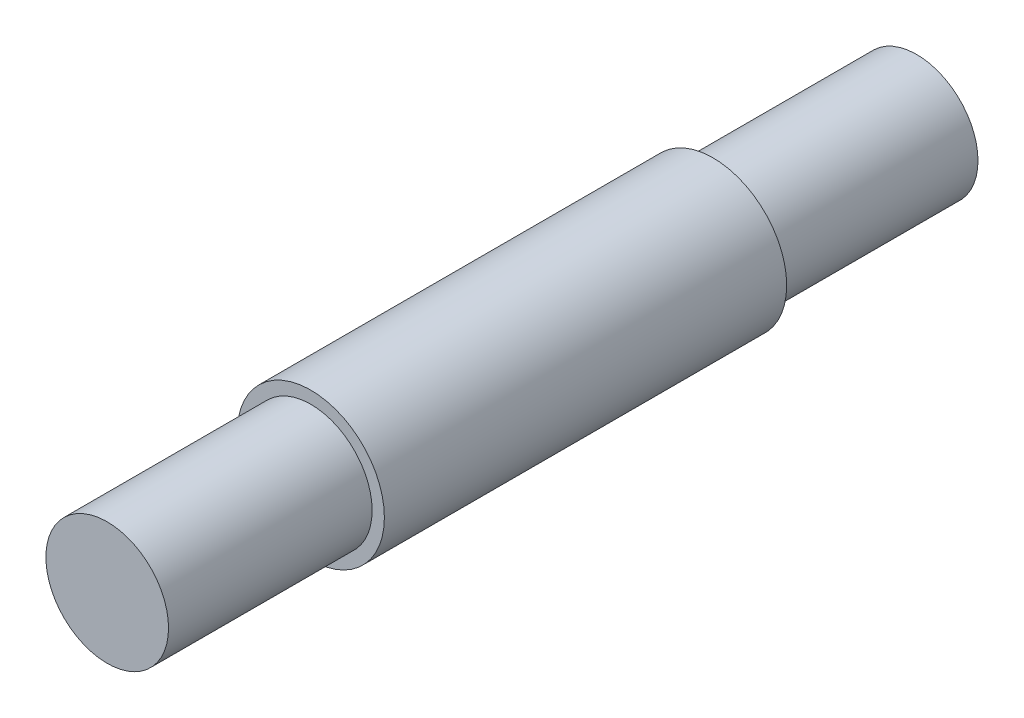
ISO-10303-21;
HEADER;
FILE_DESCRIPTION(('STEP AP214'),'2;1');
FILE_NAME('part.step','',(''),(''),'','','');
FILE_SCHEMA(('AUTOMOTIVE_DESIGN { 1 0 10303 214 1 1 1 1 }'));
ENDSEC;
DATA;
#1=APPLICATION_CONTEXT('core data for automotive mechanical design processes');
#2=APPLICATION_PROTOCOL_DEFINITION('international standard','automotive_design',2000,#1);
#3=PRODUCT_CONTEXT('',#1,'mechanical');
#4=PRODUCT('Part','Part','',(#3));
#5=PRODUCT_RELATED_PRODUCT_CATEGORY('part','',(#4));
#6=PRODUCT_DEFINITION_FORMATION('','',#4);
#7=PRODUCT_DEFINITION_CONTEXT('part definition',#1,'design');
#8=PRODUCT_DEFINITION('design','',#6,#7);
#9=PRODUCT_DEFINITION_SHAPE('','',#8);
#10=(LENGTH_UNIT() NAMED_UNIT(*) SI_UNIT(.MILLI.,.METRE.));
#11=(NAMED_UNIT(*) PLANE_ANGLE_UNIT() SI_UNIT($,.RADIAN.));
#12=(NAMED_UNIT(*) SI_UNIT($,.STERADIAN.) SOLID_ANGLE_UNIT());
#13=UNCERTAINTY_MEASURE_WITH_UNIT(LENGTH_MEASURE(1.E-05),#10,'distance_accuracy_value','');
#14=(GEOMETRIC_REPRESENTATION_CONTEXT(3) GLOBAL_UNCERTAINTY_ASSIGNED_CONTEXT((#13)) GLOBAL_UNIT_ASSIGNED_CONTEXT((#10,
#11,#12)) REPRESENTATION_CONTEXT('',''));
#15=CARTESIAN_POINT('',(0.,0.,0.));
#16=DIRECTION('',(0.,0.,1.));
#17=DIRECTION('',(1.,0.,0.));
#18=AXIS2_PLACEMENT_3D('',#15,#16,#17);
#19=CARTESIAN_POINT('',(0.,0.,83.));
#20=DIRECTION('',(0.,0.,-1.));
#21=DIRECTION('',(-1.,0.,0.));
#22=AXIS2_PLACEMENT_3D('',#19,#20,#21);
#23=CYLINDRICAL_SURFACE('',#22,25.);
#24=CARTESIAN_POINT('',(0.,0.,83.));
#25=DIRECTION('',(0.,0.,1.));
#26=DIRECTION('',(1.,0.,0.));
#27=AXIS2_PLACEMENT_3D('',#24,#25,#26);
#28=CIRCLE('',#27,25.);
#29=CARTESIAN_POINT('',(25.,0.,83.));
#30=VERTEX_POINT('',#29);
#31=EDGE_CURVE('E52',#30,#30,#28,.T.);
#32=ORIENTED_EDGE('',*,*,#31,.F.);
#33=EDGE_LOOP('',(#32));
#34=FACE_BOUND('',#33,.T.);
#35=CARTESIAN_POINT('',(0.,0.,0.));
#36=DIRECTION('',(0.,0.,1.));
#37=DIRECTION('',(1.,0.,0.));
#38=AXIS2_PLACEMENT_3D('',#35,#36,#37);
#39=CIRCLE('',#38,25.);
#40=CARTESIAN_POINT('',(25.,0.,0.));
#41=VERTEX_POINT('',#40);
#42=EDGE_CURVE('E48',#41,#41,#39,.T.);
#43=ORIENTED_EDGE('',*,*,#42,.T.);
#44=EDGE_LOOP('',(#43));
#45=FACE_BOUND('',#44,.T.);
#46=ADVANCED_FACE('F45',(#34,#45),#23,.T.);
#47=CARTESIAN_POINT('',(0.,0.,0.));
#48=DIRECTION('',(0.,0.,1.));
#49=DIRECTION('',(1.,0.,0.));
#50=AXIS2_PLACEMENT_3D('',#47,#48,#49);
#51=PLANE('',#50);
#52=ORIENTED_EDGE('',*,*,#42,.F.);
#53=EDGE_LOOP('',(#52));
#54=FACE_BOUND('',#53,.T.);
#55=ADVANCED_FACE('F86',(#54),#51,.F.);
#56=CARTESIAN_POINT('',(0.,0.,247.));
#57=DIRECTION('',(0.,0.,-1.));
#58=DIRECTION('',(-1.,0.,0.));
#59=AXIS2_PLACEMENT_3D('',#56,#57,#58);
#60=CYLINDRICAL_SURFACE('',#59,30.);
#61=CARTESIAN_POINT('',(0.,0.,247.));
#62=DIRECTION('',(0.,0.,1.));
#63=DIRECTION('',(1.,0.,0.));
#64=AXIS2_PLACEMENT_3D('',#61,#62,#63);
#65=CIRCLE('',#64,30.);
#66=CARTESIAN_POINT('',(30.,0.,247.));
#67=VERTEX_POINT('',#66);
#68=EDGE_CURVE('E60',#67,#67,#65,.T.);
#69=ORIENTED_EDGE('',*,*,#68,.F.);
#70=EDGE_LOOP('',(#69));
#71=FACE_BOUND('',#70,.T.);
#72=CARTESIAN_POINT('',(0.,0.,83.));
#73=DIRECTION('',(0.,0.,1.));
#74=DIRECTION('',(1.,0.,0.));
#75=AXIS2_PLACEMENT_3D('',#72,#73,#74);
#76=CIRCLE('',#75,30.);
#77=CARTESIAN_POINT('',(30.,0.,83.));
#78=VERTEX_POINT('',#77);
#79=EDGE_CURVE('E63',#78,#78,#76,.T.);
#80=ORIENTED_EDGE('',*,*,#79,.T.);
#81=EDGE_LOOP('',(#80));
#82=FACE_BOUND('',#81,.T.);
#83=ADVANCED_FACE('F91',(#71,#82),#60,.T.);
#84=CARTESIAN_POINT('',(0.,0.,247.));
#85=DIRECTION('',(0.,0.,1.));
#86=DIRECTION('',(1.,0.,0.));
#87=AXIS2_PLACEMENT_3D('',#84,#85,#86);
#88=PLANE('',#87);
#89=CARTESIAN_POINT('',(0.,0.,247.));
#90=DIRECTION('',(0.,0.,1.));
#91=DIRECTION('',(1.,0.,0.));
#92=AXIS2_PLACEMENT_3D('',#89,#90,#91);
#93=CIRCLE('',#92,25.);
#94=CARTESIAN_POINT('',(25.,0.,247.));
#95=VERTEX_POINT('',#94);
#96=EDGE_CURVE('E10',#95,#95,#93,.T.);
#97=ORIENTED_EDGE('',*,*,#96,.F.);
#98=EDGE_LOOP('',(#97));
#99=FACE_BOUND('',#98,.T.);
#100=ORIENTED_EDGE('',*,*,#68,.T.);
#101=EDGE_LOOP('',(#100));
#102=FACE_BOUND('',#101,.T.);
#103=ADVANCED_FACE('F81',(#99,#102),#88,.T.);
#104=CARTESIAN_POINT('',(0.,0.,83.));
#105=DIRECTION('',(0.,0.,1.));
#106=DIRECTION('',(1.,0.,0.));
#107=AXIS2_PLACEMENT_3D('',#104,#105,#106);
#108=PLANE('',#107);
#109=ORIENTED_EDGE('',*,*,#31,.T.);
#110=EDGE_LOOP('',(#109));
#111=FACE_BOUND('',#110,.T.);
#112=ORIENTED_EDGE('',*,*,#79,.F.);
#113=EDGE_LOOP('',(#112));
#114=FACE_BOUND('',#113,.T.);
#115=ADVANCED_FACE('F74',(#111,#114),#108,.F.);
#116=CARTESIAN_POINT('',(0.,0.,330.));
#117=DIRECTION('',(0.,0.,-1.));
#118=DIRECTION('',(-1.,0.,0.));
#119=AXIS2_PLACEMENT_3D('',#116,#117,#118);
#120=CYLINDRICAL_SURFACE('',#119,25.);
#121=CARTESIAN_POINT('',(0.,0.,330.));
#122=DIRECTION('',(0.,0.,1.));
#123=DIRECTION('',(1.,0.,0.));
#124=AXIS2_PLACEMENT_3D('',#121,#122,#123);
#125=CIRCLE('',#124,25.);
#126=CARTESIAN_POINT('',(25.,0.,330.));
#127=VERTEX_POINT('',#126);
#128=EDGE_CURVE('E59',#127,#127,#125,.T.);
#129=ORIENTED_EDGE('',*,*,#128,.F.);
#130=EDGE_LOOP('',(#129));
#131=FACE_BOUND('',#130,.T.);
#132=ORIENTED_EDGE('',*,*,#96,.T.);
#133=EDGE_LOOP('',(#132));
#134=FACE_BOUND('',#133,.T.);
#135=ADVANCED_FACE('F72',(#131,#134),#120,.T.);
#136=CARTESIAN_POINT('',(0.,0.,330.));
#137=DIRECTION('',(0.,0.,1.));
#138=DIRECTION('',(1.,0.,0.));
#139=AXIS2_PLACEMENT_3D('',#136,#137,#138);
#140=PLANE('',#139);
#141=ORIENTED_EDGE('',*,*,#128,.T.);
#142=EDGE_LOOP('',(#141));
#143=FACE_BOUND('',#142,.T.);
#144=ADVANCED_FACE('F70',(#143),#140,.T.);
#145=CLOSED_SHELL('',(#46,#55,#83,#103,#115,#135,#144));
#146=MANIFOLD_SOLID_BREP('B2',#145);
#147=ADVANCED_BREP_SHAPE_REPRESENTATION('',(#18,#146),#14);
#148=SHAPE_DEFINITION_REPRESENTATION(#9,#147);
ENDSEC;
END-ISO-10303-21;
